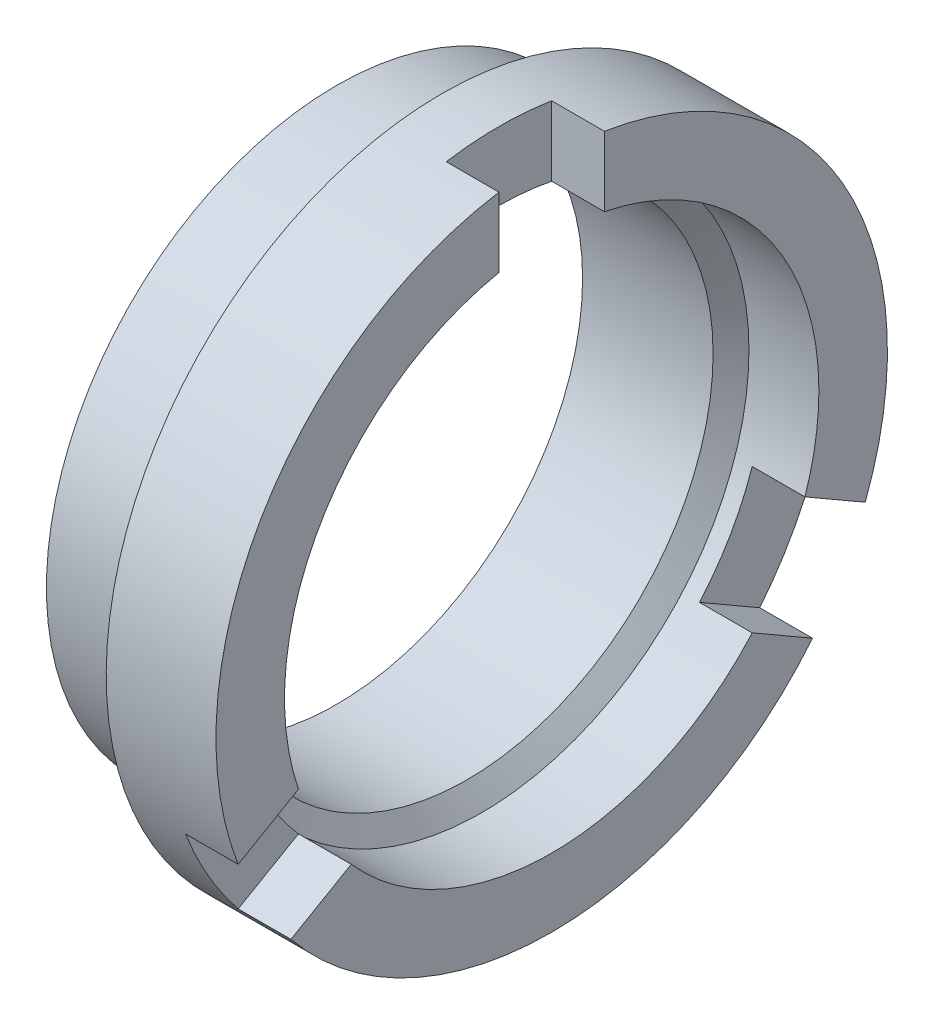
ISO-10303-21;
HEADER;
FILE_DESCRIPTION(('STEP AP214'),'2;1');
FILE_NAME('part.step','',(''),(''),'','','');
FILE_SCHEMA(('AUTOMOTIVE_DESIGN { 1 0 10303 214 1 1 1 1 }'));
ENDSEC;
DATA;
#1=APPLICATION_CONTEXT('core data for automotive mechanical design processes');
#2=APPLICATION_PROTOCOL_DEFINITION('international standard','automotive_design',2000,#1);
#3=PRODUCT_CONTEXT('',#1,'mechanical');
#4=PRODUCT('Part','Part','',(#3));
#5=PRODUCT_RELATED_PRODUCT_CATEGORY('part','',(#4));
#6=PRODUCT_DEFINITION_FORMATION('','',#4);
#7=PRODUCT_DEFINITION_CONTEXT('part definition',#1,'design');
#8=PRODUCT_DEFINITION('design','',#6,#7);
#9=PRODUCT_DEFINITION_SHAPE('','',#8);
#10=(LENGTH_UNIT() NAMED_UNIT(*) SI_UNIT(.MILLI.,.METRE.));
#11=(NAMED_UNIT(*) PLANE_ANGLE_UNIT() SI_UNIT($,.RADIAN.));
#12=(NAMED_UNIT(*) SI_UNIT($,.STERADIAN.) SOLID_ANGLE_UNIT());
#13=UNCERTAINTY_MEASURE_WITH_UNIT(LENGTH_MEASURE(1.E-05),#10,'distance_accuracy_value','');
#14=(GEOMETRIC_REPRESENTATION_CONTEXT(3) GLOBAL_UNCERTAINTY_ASSIGNED_CONTEXT((#13)) GLOBAL_UNIT_ASSIGNED_CONTEXT((#10,
#11,#12)) REPRESENTATION_CONTEXT('',''));
#15=CARTESIAN_POINT('',(0.,0.,0.));
#16=DIRECTION('',(0.,0.,1.));
#17=DIRECTION('',(1.,0.,0.));
#18=AXIS2_PLACEMENT_3D('',#15,#16,#17);
#19=CARTESIAN_POINT('',(-114.182210271339,-2.88366824144157,12.7336330130561));
#20=DIRECTION('',(-1.,0.,0.));
#21=DIRECTION('',(0.,0.,1.));
#22=AXIS2_PLACEMENT_3D('',#19,#20,#21);
#23=PLANE('',#22);
#24=CARTESIAN_POINT('',(-114.182210271339,-2.88366824144157,12.7336330130561));
#25=DIRECTION('',(-1.,0.,0.));
#26=DIRECTION('',(0.,0.,1.));
#27=AXIS2_PLACEMENT_3D('',#24,#25,#26);
#28=CIRCLE('',#27,9.55);
#29=CARTESIAN_POINT('',(-114.182210271339,-8.89843799766828,5.31574619944263));
#30=VERTEX_POINT('',#29);
#31=CARTESIAN_POINT('',(-114.182210271339,-8.8984379976684,20.1515198266695));
#32=VERTEX_POINT('',#31);
#33=EDGE_CURVE('E261',#30,#32,#28,.T.);
#34=ORIENTED_EDGE('',*,*,#33,.F.);
#35=DIRECTION('',(0.,0.499999999999992,0.866025403784443));
#36=VECTOR('',#35,1.);
#37=CARTESIAN_POINT('',(-114.182210271339,-10.7061606628907,2.18467869728347));
#38=LINE('',#37,#36);
#39=CARTESIAN_POINT('',(-114.182210271339,-7.90795801646888,7.0313078507599));
#40=VERTEX_POINT('',#39);
#41=EDGE_CURVE('E141',#30,#40,#38,.T.);
#42=ORIENTED_EDGE('',*,*,#41,.T.);
#43=CARTESIAN_POINT('',(-114.182210271339,-2.88366824144159,12.7336330130561));
#44=DIRECTION('',(-1.,0.,0.));
#45=DIRECTION('',(0.,0.,1.));
#46=AXIS2_PLACEMENT_3D('',#43,#44,#45);
#47=CIRCLE('',#46,7.6);
#48=CARTESIAN_POINT('',(-114.182210271339,-7.90795801646896,18.4359581753522));
#49=VERTEX_POINT('',#48);
#50=EDGE_CURVE('E56',#40,#49,#47,.T.);
#51=ORIENTED_EDGE('',*,*,#50,.T.);
#52=DIRECTION('',(0.,0.500000000000004,-0.866025403784436));
#53=VECTOR('',#52,1.);
#54=CARTESIAN_POINT('',(-114.182210271339,-10.7061606628909,23.2825873288286));
#55=LINE('',#54,#53);
#56=EDGE_CURVE('E167',#32,#49,#55,.T.);
#57=ORIENTED_EDGE('',*,*,#56,.F.);
#58=EDGE_LOOP('',(#34,#42,#51,#57));
#59=FACE_BOUND('',#58,.T.);
#60=ADVANCED_FACE('F31',(#59),#23,.F.);
#61=CARTESIAN_POINT('',(-114.182210271339,-6.30036178631508,21.6515198266695));
#62=VERTEX_POINT('',#61);
#63=CARTESIAN_POINT('',(-114.182210271339,6.54779505965864,14.2336330130561));
#64=VERTEX_POINT('',#63);
#65=EDGE_CURVE('E262',#62,#64,#28,.T.);
#66=ORIENTED_EDGE('',*,*,#65,.F.);
#67=DIRECTION('',(0.,0.500000000000004,-0.866025403784436));
#68=VECTOR('',#67,1.);
#69=CARTESIAN_POINT('',(-114.182210271339,-8.10808445153759,24.7825873288287));
#70=LINE('',#69,#68);
#71=CARTESIAN_POINT('',(-114.182210271339,-5.30988180511565,19.9359581753522));
#72=VERTEX_POINT('',#71);
#73=EDGE_CURVE('E168',#62,#72,#70,.T.);
#74=ORIENTED_EDGE('',*,*,#73,.T.);
#75=CARTESIAN_POINT('',(-114.182210271339,4.56683509725976,14.2336330130561));
#76=VERTEX_POINT('',#75);
#77=EDGE_CURVE('E266',#72,#76,#47,.T.);
#78=ORIENTED_EDGE('',*,*,#77,.T.);
#79=DIRECTION('',(0.,-1.,0.));
#80=VECTOR('',#79,1.);
#81=CARTESIAN_POINT('',(-114.182210271339,6.66733175855844,14.2336330130561));
#82=LINE('',#81,#80);
#83=EDGE_CURVE('E193',#64,#76,#82,.T.);
#84=ORIENTED_EDGE('',*,*,#83,.F.);
#85=EDGE_LOOP('',(#66,#74,#78,#84));
#86=FACE_BOUND('',#85,.T.);
#87=ADVANCED_FACE('F294',(#86),#23,.F.);
#88=CARTESIAN_POINT('',(-117.303649130669,41.4790301307664,1.73363301305615));
#89=DIRECTION('',(1.,0.,0.));
#90=DIRECTION('',(0.,0.,-1.));
#91=AXIS2_PLACEMENT_3D('',#88,#89,#90);
#92=PLANE('',#91);
#93=CARTESIAN_POINT('',(-117.303649130669,-2.88366824144157,12.7336330130561));
#94=DIRECTION('',(1.,0.,0.));
#95=DIRECTION('',(0.,1.,0.));
#96=AXIS2_PLACEMENT_3D('',#93,#94,#95);
#97=CIRCLE('',#96,9.55);
#98=CARTESIAN_POINT('',(-117.303649130669,6.66633175855844,12.7336330130561));
#99=VERTEX_POINT('',#98);
#100=EDGE_CURVE('E258',#99,#99,#97,.T.);
#101=ORIENTED_EDGE('',*,*,#100,.F.);
#102=EDGE_LOOP('',(#101));
#103=FACE_BOUND('',#102,.T.);
#104=CARTESIAN_POINT('',(-117.303649130669,-2.88366824144157,12.7336330130561));
#105=DIRECTION('',(1.,0.,0.));
#106=DIRECTION('',(0.,1.,0.));
#107=AXIS2_PLACEMENT_3D('',#104,#105,#106);
#108=CIRCLE('',#107,8.25);
#109=CARTESIAN_POINT('',(-117.303649130669,5.36633175855843,12.7336330130561));
#110=VERTEX_POINT('',#109);
#111=EDGE_CURVE('E11',#110,#110,#108,.F.);
#112=ORIENTED_EDGE('',*,*,#111,.F.);
#113=EDGE_LOOP('',(#112));
#114=FACE_BOUND('',#113,.T.);
#115=ADVANCED_FACE('F33',(#103,#114),#92,.F.);
#116=CARTESIAN_POINT('',(-114.182210271339,4.56683509725976,11.2336330130561));
#117=VERTEX_POINT('',#116);
#118=CARTESIAN_POINT('',(-114.182210271339,-5.30988180511554,5.53130785075992));
#119=VERTEX_POINT('',#118);
#120=EDGE_CURVE('E35',#117,#119,#47,.T.);
#121=ORIENTED_EDGE('',*,*,#120,.T.);
#122=DIRECTION('',(0.,0.499999999999992,0.866025403784443));
#123=VECTOR('',#122,1.);
#124=CARTESIAN_POINT('',(-114.182210271339,-8.10808445153738,0.684678697283492));
#125=LINE('',#124,#123);
#126=CARTESIAN_POINT('',(-114.182210271339,-6.30036178631494,3.81574619944265));
#127=VERTEX_POINT('',#126);
#128=EDGE_CURVE('E48',#127,#119,#125,.T.);
#129=ORIENTED_EDGE('',*,*,#128,.F.);
#130=CARTESIAN_POINT('',(-114.182210271339,6.54779505965864,11.2336330130561));
#131=VERTEX_POINT('',#130);
#132=EDGE_CURVE('E40',#131,#127,#28,.T.);
#133=ORIENTED_EDGE('',*,*,#132,.F.);
#134=DIRECTION('',(0.,-1.,0.));
#135=VECTOR('',#134,1.);
#136=CARTESIAN_POINT('',(-114.182210271339,6.66733175855844,11.2336330130561));
#137=LINE('',#136,#135);
#138=EDGE_CURVE('E194',#131,#117,#137,.T.);
#139=ORIENTED_EDGE('',*,*,#138,.T.);
#140=EDGE_LOOP('',(#121,#129,#133,#139));
#141=FACE_BOUND('',#140,.T.);
#142=ADVANCED_FACE('F273',(#141),#23,.F.);
#143=CARTESIAN_POINT('',(-148.315128171995,-2.88366824144157,12.7336330130561));
#144=DIRECTION('',(1.,0.,0.));
#145=DIRECTION('',(0.,0.,-1.));
#146=AXIS2_PLACEMENT_3D('',#143,#144,#145);
#147=CYLINDRICAL_SURFACE('',#146,9.55);
#148=ORIENTED_EDGE('',*,*,#100,.T.);
#149=EDGE_LOOP('',(#148));
#150=FACE_BOUND('',#149,.T.);
#151=CARTESIAN_POINT('',(-115.682210271339,-2.88366824144157,12.7336330130561));
#152=DIRECTION('',(-1.,0.,0.));
#153=DIRECTION('',(0.,0.,1.));
#154=AXIS2_PLACEMENT_3D('',#151,#152,#153);
#155=CIRCLE('',#154,9.55);
#156=CARTESIAN_POINT('',(-115.682210271339,-8.89843799766828,5.31574619944263));
#157=VERTEX_POINT('',#156);
#158=CARTESIAN_POINT('',(-115.682210271339,-6.30036178631494,3.81574619944265));
#159=VERTEX_POINT('',#158);
#160=EDGE_CURVE('E131',#157,#159,#155,.F.);
#161=ORIENTED_EDGE('',*,*,#160,.F.);
#162=DIRECTION('',(1.,0.,0.));
#163=VECTOR('',#162,1.);
#164=CARTESIAN_POINT('',(-148.315128171995,-8.89843799766828,5.31574619944263));
#165=LINE('',#164,#163);
#166=EDGE_CURVE('E149',#30,#157,#165,.F.);
#167=ORIENTED_EDGE('',*,*,#166,.F.);
#168=ORIENTED_EDGE('',*,*,#33,.T.);
#169=DIRECTION('',(1.,0.,0.));
#170=VECTOR('',#169,1.);
#171=CARTESIAN_POINT('',(-148.315128171995,-8.89843799766839,20.1515198266695));
#172=LINE('',#171,#170);
#173=CARTESIAN_POINT('',(-115.682210271339,-8.89843799766839,20.1515198266695));
#174=VERTEX_POINT('',#173);
#175=EDGE_CURVE('E179',#174,#32,#172,.T.);
#176=ORIENTED_EDGE('',*,*,#175,.F.);
#177=CARTESIAN_POINT('',(-115.682210271339,-2.88366824144157,12.7336330130561));
#178=DIRECTION('',(-1.,0.,0.));
#179=DIRECTION('',(0.,0.,1.));
#180=AXIS2_PLACEMENT_3D('',#177,#178,#179);
#181=CIRCLE('',#180,9.55);
#182=CARTESIAN_POINT('',(-115.682210271339,-6.30036178631508,21.6515198266695));
#183=VERTEX_POINT('',#182);
#184=EDGE_CURVE('E161',#183,#174,#181,.F.);
#185=ORIENTED_EDGE('',*,*,#184,.F.);
#186=DIRECTION('',(1.,0.,0.));
#187=VECTOR('',#186,1.);
#188=CARTESIAN_POINT('',(-148.315128171995,-6.30036178631508,21.6515198266695));
#189=LINE('',#188,#187);
#190=EDGE_CURVE('E164',#62,#183,#189,.F.);
#191=ORIENTED_EDGE('',*,*,#190,.F.);
#192=ORIENTED_EDGE('',*,*,#65,.T.);
#193=DIRECTION('',(1.,0.,0.));
#194=VECTOR('',#193,1.);
#195=CARTESIAN_POINT('',(-148.315128171995,6.54779505965864,14.2336330130561));
#196=LINE('',#195,#194);
#197=CARTESIAN_POINT('',(-115.682210271339,6.54779505965864,14.2336330130561));
#198=VERTEX_POINT('',#197);
#199=EDGE_CURVE('E206',#198,#64,#196,.T.);
#200=ORIENTED_EDGE('',*,*,#199,.F.);
#201=CARTESIAN_POINT('',(-115.682210271339,-2.88366824144157,12.7336330130561));
#202=DIRECTION('',(-1.,0.,0.));
#203=DIRECTION('',(0.,-1.,0.));
#204=AXIS2_PLACEMENT_3D('',#201,#202,#203);
#205=CIRCLE('',#204,9.55);
#206=CARTESIAN_POINT('',(-115.682210271339,6.54779505965864,11.2336330130561));
#207=VERTEX_POINT('',#206);
#208=EDGE_CURVE('E187',#207,#198,#205,.F.);
#209=ORIENTED_EDGE('',*,*,#208,.F.);
#210=DIRECTION('',(1.,0.,0.));
#211=VECTOR('',#210,1.);
#212=CARTESIAN_POINT('',(-148.315128171995,6.54779505965864,11.2336330130561));
#213=LINE('',#212,#211);
#214=EDGE_CURVE('E190',#131,#207,#213,.F.);
#215=ORIENTED_EDGE('',*,*,#214,.F.);
#216=ORIENTED_EDGE('',*,*,#132,.T.);
#217=DIRECTION('',(1.,0.,0.));
#218=VECTOR('',#217,1.);
#219=CARTESIAN_POINT('',(-148.315128171995,-6.30036178631494,3.81574619944265));
#220=LINE('',#219,#218);
#221=EDGE_CURVE('E140',#159,#127,#220,.T.);
#222=ORIENTED_EDGE('',*,*,#221,.F.);
#223=EDGE_LOOP('',(#161,#167,#168,#176,#185,#191,#192,#200,#209,#215,#216,#222));
#224=FACE_BOUND('',#223,.T.);
#225=ADVANCED_FACE('F299',(#150,#224),#147,.T.);
#226=CARTESIAN_POINT('',(-148.315128171995,-2.88366824144157,12.7336330130561));
#227=DIRECTION('',(1.,0.,0.));
#228=DIRECTION('',(0.,0.,-1.));
#229=AXIS2_PLACEMENT_3D('',#226,#227,#228);
#230=CYLINDRICAL_SURFACE('',#229,6.99999999999997);
#231=CARTESIAN_POINT('',(-116.591349033031,-2.88366824144159,12.7336330130561));
#232=DIRECTION('',(1.,0.,0.));
#233=DIRECTION('',(0.,0.,-1.));
#234=AXIS2_PLACEMENT_3D('',#231,#232,#233);
#235=CIRCLE('',#234,6.99999999999994);
#236=CARTESIAN_POINT('',(-116.591349033031,-2.88366824144159,5.73363301305614));
#237=VERTEX_POINT('',#236);
#238=EDGE_CURVE('E264',#237,#237,#235,.F.);
#239=ORIENTED_EDGE('',*,*,#238,.F.);
#240=EDGE_LOOP('',(#239));
#241=FACE_BOUND('',#240,.T.);
#242=CARTESIAN_POINT('',(-120.303649130669,-2.88366824144157,12.7336330130561));
#243=DIRECTION('',(1.,0.,0.));
#244=DIRECTION('',(0.,1.,0.));
#245=AXIS2_PLACEMENT_3D('',#242,#243,#244);
#246=CIRCLE('',#245,6.99999999999997);
#247=CARTESIAN_POINT('',(-120.303649130669,4.1163317585584,12.7336330130561));
#248=VERTEX_POINT('',#247);
#249=EDGE_CURVE('E255',#248,#248,#246,.T.);
#250=ORIENTED_EDGE('',*,*,#249,.F.);
#251=EDGE_LOOP('',(#250));
#252=FACE_BOUND('',#251,.T.);
#253=ADVANCED_FACE('F314',(#241,#252),#230,.F.);
#254=CARTESIAN_POINT('',(-144.638172909825,-2.88366824144156,12.7336330130561));
#255=DIRECTION('',(1.,0.,0.));
#256=DIRECTION('',(0.,1.,0.));
#257=AXIS2_PLACEMENT_3D('',#254,#255,#256);
#258=CYLINDRICAL_SURFACE('',#257,8.25);
#259=CARTESIAN_POINT('',(-120.303649130669,-2.88366824144157,12.7336330130561));
#260=DIRECTION('',(1.,0.,0.));
#261=DIRECTION('',(0.,1.,0.));
#262=AXIS2_PLACEMENT_3D('',#259,#260,#261);
#263=CIRCLE('',#262,8.25);
#264=CARTESIAN_POINT('',(-120.303649130669,5.36633175855843,12.7336330130561));
#265=VERTEX_POINT('',#264);
#266=EDGE_CURVE('E247',#265,#265,#263,.T.);
#267=ORIENTED_EDGE('',*,*,#266,.T.);
#268=EDGE_LOOP('',(#267));
#269=FACE_BOUND('',#268,.T.);
#270=ORIENTED_EDGE('',*,*,#111,.T.);
#271=EDGE_LOOP('',(#270));
#272=FACE_BOUND('',#271,.T.);
#273=ADVANCED_FACE('F231',(#269,#272),#258,.T.);
#274=CARTESIAN_POINT('',(-120.303649130669,41.4790301307664,1.73363301305615));
#275=DIRECTION('',(1.,0.,0.));
#276=DIRECTION('',(0.,0.,-1.));
#277=AXIS2_PLACEMENT_3D('',#274,#275,#276);
#278=PLANE('',#277);
#279=ORIENTED_EDGE('',*,*,#249,.T.);
#280=EDGE_LOOP('',(#279));
#281=FACE_BOUND('',#280,.T.);
#282=ORIENTED_EDGE('',*,*,#266,.F.);
#283=EDGE_LOOP('',(#282));
#284=FACE_BOUND('',#283,.T.);
#285=ADVANCED_FACE('F229',(#281,#284),#278,.F.);
#286=CARTESIAN_POINT('',(-113.463649130669,-2.88366824144159,12.7336330130561));
#287=DIRECTION('',(1.,0.,0.));
#288=DIRECTION('',(0.,0.,-1.));
#289=AXIS2_PLACEMENT_3D('',#286,#287,#288);
#290=CYLINDRICAL_SURFACE('',#289,7.6);
#291=CARTESIAN_POINT('',(-116.171174505176,-2.8836682414416,5.13363301301582));
#292=CARTESIAN_POINT('',(-116.171174505176,-2.75931340665847,5.13363037514192));
#293=CARTESIAN_POINT('',(-116.171174505176,-2.63495879633258,5.13668504286559));
#294=CARTESIAN_POINT('',(-116.171174505176,-2.38654903677079,5.14889004884917));
#295=CARTESIAN_POINT('',(-116.171174505176,-2.2624938875349,5.15804038710912));
#296=CARTESIAN_POINT('',(-116.171174505176,-2.01498206233009,5.18241779350636));
#297=CARTESIAN_POINT('',(-116.171174505176,-1.89152538636117,5.19764486164365));
#298=CARTESIAN_POINT('',(-116.171174505175,-1.64550788478678,5.23413821292448));
#299=CARTESIAN_POINT('',(-116.171174505175,-1.52294705918129,5.25540449606797));
#300=CARTESIAN_POINT('',(-116.171174505175,-1.27901652904238,5.30392526783343));
#301=CARTESIAN_POINT('',(-116.171174505176,-1.15764682450896,5.33117975645542));
#302=CARTESIAN_POINT('',(-116.171174505176,-0.916390923827755,5.39161122102182));
#303=CARTESIAN_POINT('',(-116.171174505175,-0.796504727679993,5.4247881969663));
#304=CARTESIAN_POINT('',(-116.171174505176,-0.558504660909136,5.49698472594015));
#305=CARTESIAN_POINT('',(-116.171174505179,-0.44039079028602,5.53600427896944));
#306=CARTESIAN_POINT('',(-116.171174505173,-0.206219921004956,5.61979195628669));
#307=CARTESIAN_POINT('',(-116.171174505164,-0.0901629223469907,5.66456008057459));
#308=CARTESIAN_POINT('',(-116.171174505185,0.139614611444968,5.75973705128879));
#309=CARTESIAN_POINT('',(-116.171174505213,0.253335146578952,5.8101458977151));
#310=CARTESIAN_POINT('',(-116.171174505214,0.478165790664665,5.9164828729484));
#311=CARTESIAN_POINT('',(-116.171174505186,0.5892758996164,5.97241100175537));
#312=CARTESIAN_POINT('',(-116.171174505165,0.808618017293205,6.08965180619201));
#313=CARTESIAN_POINT('',(-116.171174505173,0.916850026018243,6.15096448182175));
#314=CARTESIAN_POINT('',(-116.171174505178,1.13017520287799,6.27882667221756));
#315=CARTESIAN_POINT('',(-116.171174505177,1.23526837101277,6.34537618698353));
#316=CARTESIAN_POINT('',(-116.171174505176,1.44206268804282,6.48355173206294));
#317=CARTESIAN_POINT('',(-116.171174505176,1.54376383693804,6.55517776237649));
#318=CARTESIAN_POINT('',(-116.171174505175,1.74352910851079,6.70333378516427));
#319=CARTESIAN_POINT('',(-116.171174505175,1.84159323118838,6.77986377763845));
#320=CARTESIAN_POINT('',(-116.171174505176,2.03384820526523,6.93764335729586));
#321=CARTESIAN_POINT('',(-116.171174505177,2.12803905666447,7.0188929444791));
#322=CARTESIAN_POINT('',(-116.171174505176,2.3123205741772,7.18591597617724));
#323=CARTESIAN_POINT('',(-116.171174505174,2.4024112402907,7.27168942069213));
#324=CARTESIAN_POINT('',(-116.171174505174,2.57827535091973,7.44755353132104));
#325=CARTESIAN_POINT('',(-116.171174505176,2.66404879543524,7.53764419743508));
#326=CARTESIAN_POINT('',(-116.171174505177,2.83107182713533,7.72192571494996));
#327=CARTESIAN_POINT('',(-116.171174505176,2.91232141431986,7.81611656635084));
#328=CARTESIAN_POINT('',(-116.171174505175,3.07010099397785,8.00837154042824));
#329=CARTESIAN_POINT('',(-116.171174505175,3.14663098645146,8.10643566310463));
#330=CARTESIAN_POINT('',(-116.171174505176,3.2947870092374,8.30620093467638));
#331=CARTESIAN_POINT('',(-116.171174505177,3.36641303954962,8.40790208357182));
#332=CARTESIAN_POINT('',(-116.171174505176,3.50458858463239,8.61469640060082));
#333=CARTESIAN_POINT('',(-116.171174505175,3.571138099403,8.71978956873434));
#334=CARTESIAN_POINT('',(-116.171174505175,3.69900028978814,8.93311474559847));
#335=CARTESIAN_POINT('',(-116.171174505177,3.7603129654026,9.0413467543291));
#336=CARTESIAN_POINT('',(-116.171174505176,3.87755376987727,9.26068887199177));
#337=CARTESIAN_POINT('',(-116.171174505174,3.93348189873753,9.37179898092379));
#338=CARTESIAN_POINT('',(-116.171174505174,4.03981887393216,9.59662962501151));
#339=CARTESIAN_POINT('',(-116.171174505176,4.09022772026649,9.71035016016723));
#340=CARTESIAN_POINT('',(-116.171174505173,4.18540469109976,9.94012769396533));
#341=CARTESIAN_POINT('',(-116.171174505167,4.23017281559869,10.0561846926077));
#342=CARTESIAN_POINT('',(-116.171174505186,4.31396049237383,10.2903555619184));
#343=CARTESIAN_POINT('',(-116.171174505211,4.35298004465015,10.4084694325868));
#344=CARTESIAN_POINT('',(-116.171174505219,4.4251765755622,10.6464694992637));
#345=CARTESIAN_POINT('',(-116.171174505203,4.45835355419781,10.7663556952723));
#346=CARTESIAN_POINT('',(-116.171174505228,4.51878501144078,11.0076115963157));
#347=CARTESIAN_POINT('',(-116.17117450527,4.54603949004826,11.1289813013505));
#348=CARTESIAN_POINT('',(-116.171174505318,4.59456028894012,11.3729118301645));
#349=CARTESIAN_POINT('',(-116.171174505324,4.61582660922446,11.4954726539437));
#350=CARTESIAN_POINT('',(-116.171174505265,4.65231985909626,11.7414901604902));
#351=CARTESIAN_POINT('',(-116.171174505199,4.66754678868372,11.8649468432575));
#352=CARTESIAN_POINT('',(-116.171174505152,4.69192457393092,12.1124586498431));
#353=CARTESIAN_POINT('',(-116.17117450517,4.70107542959063,12.2365137736615));
#354=CARTESIAN_POINT('',(-116.171174505182,4.71327902192376,12.4849236026718));
#355=CARTESIAN_POINT('',(-116.171174505177,4.71633175859716,12.6092783078638));
#356=CARTESIAN_POINT('',(-116.171174505174,4.71633175860019,12.8579877182495));
#357=CARTESIAN_POINT('',(-116.171174505178,4.71327902192977,12.9823424234431));
#358=CARTESIAN_POINT('',(-116.171174505174,4.70107542958436,13.2307522524534));
#359=CARTESIAN_POINT('',(-116.171174505167,4.69192457390943,13.35480737627));
#360=CARTESIAN_POINT('',(-116.171174505185,4.66754678870356,13.602319182861));
#361=CARTESIAN_POINT('',(-116.171174505211,4.65231985917261,13.7257758656352));
#362=CARTESIAN_POINT('',(-116.171174505219,4.61582660937485,13.9717933721942));
#363=CARTESIAN_POINT('',(-116.1711745052,4.5945602891081,14.0943541959789));
#364=CARTESIAN_POINT('',(-116.171174505229,4.54603949010666,14.3382847247708));
#365=CARTESIAN_POINT('',(-116.171174505277,4.51878501137193,14.4596544297779));
#366=CARTESIAN_POINT('',(-116.171174505312,4.45835355404396,14.7009103308017));
#367=CARTESIAN_POINT('',(-116.171174505299,4.42517657545079,14.8207965268184));
#368=CARTESIAN_POINT('',(-116.17117450529,4.35298004454146,15.0587965934898));
#369=CARTESIAN_POINT('',(-116.171174505294,4.31396049222537,15.1769104641445));
#370=CARTESIAN_POINT('',(-116.171174505297,4.23017281542143,15.411081333442));
#371=CARTESIAN_POINT('',(-116.171174505295,4.18540469093353,15.5271383320848));
#372=CARTESIAN_POINT('',(-116.171174505294,4.09022772010958,15.7569158658786));
#373=CARTESIAN_POINT('',(-116.171174505294,4.03981887377357,15.8706364010297));
#374=CARTESIAN_POINT('',(-116.171174505294,3.93348189858104,16.0954670451115));
#375=CARTESIAN_POINT('',(-116.171174505295,3.87755376972452,16.2065771540421));
#376=CARTESIAN_POINT('',(-116.171174505295,3.76031296525299,16.4259192716985));
#377=CARTESIAN_POINT('',(-116.171174505296,3.69900028963799,16.5341512804243));
#378=CARTESIAN_POINT('',(-116.171174505294,3.57113809925697,16.7474764572845));
#379=CARTESIAN_POINT('',(-116.171174505292,3.50458858449091,16.852569625419));
#380=CARTESIAN_POINT('',(-116.171174505294,3.36641303941052,17.0593639424428));
#381=CARTESIAN_POINT('',(-116.171174505297,3.29478700909619,17.1610650913323));
#382=CARTESIAN_POINT('',(-116.171174505296,3.14663098631212,17.3608303629021));
#383=CARTESIAN_POINT('',(-116.171174505292,3.0701009938423,17.4588944855824));
#384=CARTESIAN_POINT('',(-116.171174505292,2.91232141418752,17.6511494596561));
#385=CARTESIAN_POINT('',(-116.171174505297,2.83107182700265,17.7453403110495));
#386=CARTESIAN_POINT('',(-116.171174505297,2.66404879530728,17.9296218285552));
#387=CARTESIAN_POINT('',(-116.171174505294,2.57827535079678,18.0197124946675));
#388=CARTESIAN_POINT('',(-116.171174505289,2.4024112401774,18.1955766052977));
#389=CARTESIAN_POINT('',(-116.171174505287,2.31232057406847,18.2813500498156));
#390=CARTESIAN_POINT('',(-116.1711745053,2.12803905654825,18.4483730814963));
#391=CARTESIAN_POINT('',(-116.171174505316,2.03384820513698,18.5296226686592));
#392=CARTESIAN_POINT('',(-116.171174505265,1.84159323110801,18.687402248371));
#393=CARTESIAN_POINT('',(-116.171174505199,1.74352910849026,18.7639322409199));
#394=CARTESIAN_POINT('',(-116.171174505154,1.54376383696017,18.9120882637578));
#395=CARTESIAN_POINT('',(-116.171174505175,1.44206268804777,18.9837142940467));
#396=CARTESIAN_POINT('',(-116.171174505186,1.23526837100771,19.121889839117));
#397=CARTESIAN_POINT('',(-116.171174505176,1.13017520288005,19.1884393538984));
#398=CARTESIAN_POINT('',(-116.171174505172,0.916850026016989,19.3163015442909));
#399=CARTESIAN_POINT('',(-116.171174505177,0.808618017281532,19.377614219902));
#400=CARTESIAN_POINT('',(-116.171174505178,0.589275899614646,19.4948550243762));
#401=CARTESIAN_POINT('',(-116.171174505174,0.478165790683264,19.5507831532394));
#402=CARTESIAN_POINT('',(-116.171174505171,0.253335146600073,19.6571201284353));
#403=CARTESIAN_POINT('',(-116.171174505173,0.13961461144836,19.7075289747683));
#404=CARTESIAN_POINT('',(-116.171174505176,-0.0901629223532225,19.8027059455929));
#405=CARTESIAN_POINT('',(-116.171174505177,-0.20621992100327,19.847474070084));
#406=CARTESIAN_POINT('',(-116.171174505178,-0.440390790307492,19.9312617468857));
#407=CARTESIAN_POINT('',(-116.171174505177,-0.558504660961489,19.9702812991967));
#408=CARTESIAN_POINT('',(-116.171174505171,-0.796504727630565,20.0424778301269));
#409=CARTESIAN_POINT('',(-116.171174505167,-0.916390923645741,20.0756548087458));
#410=CARTESIAN_POINT('',(-116.171174505184,-1.15764682469003,20.1360862660011));
#411=CARTESIAN_POINT('',(-116.171174505205,-1.27901652971911,20.1633407446375));
#412=CARTESIAN_POINT('',(-116.171174505223,-1.52294705852943,20.2118615435729));
#413=CARTESIAN_POINT('',(-116.17117450522,-1.64550788231068,20.2331278638717));
#414=CARTESIAN_POINT('',(-116.171174505214,-1.8915253888687,20.269621113668));
#415=CARTESIAN_POINT('',(-116.17117450521,-2.01498207164543,20.2848480431656));
#416=CARTESIAN_POINT('',(-116.171174505211,-2.26249387823372,20.3092258283434));
#417=CARTESIAN_POINT('',(-116.171174505214,-2.38654900204527,20.3183766840237));
#418=CARTESIAN_POINT('',(-116.171174505217,-2.63495883105172,20.3305802763704));
#419=CARTESIAN_POINT('',(-116.171174505217,-2.75931353624665,20.3336330130363));
#420=CARTESIAN_POINT('',(-116.171174505217,-3.00802294663656,20.3336330130366));
#421=CARTESIAN_POINT('',(-116.171174505217,-3.13237765183156,20.3305802763709));
#422=CARTESIAN_POINT('',(-116.171174505215,-3.38078748083792,20.3183766840232));
#423=CARTESIAN_POINT('',(-116.171174505212,-3.50484260464931,20.3092258283415));
#424=CARTESIAN_POINT('',(-116.171174505209,-3.75235441124033,20.284848043167));
#425=CARTESIAN_POINT('',(-116.171174505209,-3.87581109401994,20.2696211136739));
#426=CARTESIAN_POINT('',(-116.171174505211,-4.1218286005781,20.2331278638835));
#427=CARTESIAN_POINT('',(-116.171174505214,-4.24438942435666,20.2118615435863));
#428=CARTESIAN_POINT('',(-116.171174505215,-4.48831995315824,20.163340744625));
#429=CARTESIAN_POINT('',(-116.171174505213,-4.60968965818124,20.1360862659609));
#430=CARTESIAN_POINT('',(-116.171174505215,-4.85094555921527,20.0756548086805));
#431=CARTESIAN_POINT('',(-116.171174505218,-4.97083175522631,20.0424778300642));
#432=CARTESIAN_POINT('',(-116.171174505219,-5.20883182190095,19.9702812991394));
#433=CARTESIAN_POINT('',(-116.171174505216,-5.32694569256448,19.9312617468306));
#434=CARTESIAN_POINT('',(-116.171174505215,-5.56111656187262,19.8474740700286));
#435=CARTESIAN_POINT('',(-116.171174505216,-5.67717356051725,19.8027059455353));
#436=CARTESIAN_POINT('',(-116.171174505209,-5.90695109431806,19.7075289747183));
#437=CARTESIAN_POINT('',(-116.171174505199,-6.02067162947434,19.6571201283949));
#438=CARTESIAN_POINT('',(-116.171174505234,-6.24550227353545,19.5507831531577));
#439=CARTESIAN_POINT('',(-116.171174505278,-6.35661238244021,19.4948550242438));
#440=CARTESIAN_POINT('',(-116.17117450531,-6.57595450007792,19.37761421973));
#441=CARTESIAN_POINT('',(-116.171174505299,-6.68418650881095,19.3163015441303));
#442=CARTESIAN_POINT('',(-116.171174505291,-6.89751168567246,19.1884393537579));
#443=CARTESIAN_POINT('',(-116.171174505296,-7.00260485380094,19.1218898389853));
#444=CARTESIAN_POINT('',(-116.171174505297,-7.20939917082728,18.9837142939035));
#445=CARTESIAN_POINT('',(-116.171174505294,-7.31110031972498,18.9120882635941));
#446=CARTESIAN_POINT('',(-116.171174505292,-7.5108655912942,18.7639322408112));
#447=CARTESIAN_POINT('',(-116.171174505294,-7.60892971396592,18.687402248338));
#448=CARTESIAN_POINT('',(-116.171174505297,-7.80118468803545,18.5296226686814));
#449=CARTESIAN_POINT('',(-116.171174505299,-7.8953755394331,18.4483730814979));
#450=CARTESIAN_POINT('',(-116.171174505298,-8.07965705694171,18.2813500498026));
#451=CARTESIAN_POINT('',(-116.171174505296,-8.16974772305277,18.1955766052909));
#452=CARTESIAN_POINT('',(-116.171174505289,-8.34561183368456,18.0197124946728));
#453=CARTESIAN_POINT('',(-116.171174505285,-8.43138527820524,17.9296218285663));
#454=CARTESIAN_POINT('',(-116.171174505298,-8.59840830988572,17.7453403110465));
#455=CARTESIAN_POINT('',(-116.171174505316,-8.67965789704557,17.6511494596332));
#456=CARTESIAN_POINT('',(-116.171174505266,-8.83743747675688,17.4588944856036));
#457=CARTESIAN_POINT('',(-116.171174505198,-8.91396746930827,17.3608303629872));
#458=CARTESIAN_POINT('',(-116.17117450515,-9.062123492148,17.1610650914612));
#459=CARTESIAN_POINT('',(-116.17117450517,-9.13374952243638,17.0593639425515));
#460=CARTESIAN_POINT('',(-116.171174505185,-9.27192506750111,16.8525696255094));
#461=CARTESIAN_POINT('',(-116.17117450518,-9.33847458227727,16.7474764573769));
#462=CARTESIAN_POINT('',(-116.171174505176,-9.46633677267188,16.5341512805112));
#463=CARTESIAN_POINT('',(-116.171174505176,-9.52764944829022,16.4259192717781));
#464=CARTESIAN_POINT('',(-116.171174505175,-9.64489025276579,16.206577154116));
#465=CARTESIAN_POINT('',(-116.171174505173,-9.70081838162338,16.0954670451872));
#466=CARTESIAN_POINT('',(-116.171174505172,-9.80715535681759,15.8706364011015));
#467=CARTESIAN_POINT('',(-116.171174505174,-9.8575642031539,15.7569158659444));
#468=CARTESIAN_POINT('',(-116.171174505175,-9.95274117397968,15.5271383321451));
#469=CARTESIAN_POINT('',(-116.171174505175,-9.99750929846937,15.411081333503));
#470=CARTESIAN_POINT('',(-116.171174505175,-10.0812969752725,15.1769104642001));
#471=CARTESIAN_POINT('',(-116.171174505174,-10.1203165275858,15.0587965935392));
#472=CARTESIAN_POINT('',(-116.171174505174,-10.1925130585092,14.8207965268626));
#473=CARTESIAN_POINT('',(-116.171174505176,-10.2256900371193,14.700910330847));
#474=CARTESIAN_POINT('',(-116.171174505176,-10.2861214943993,14.4596544298086));
#475=CARTESIAN_POINT('',(-116.171174505173,-10.3133759730691,14.3382847247859));
#476=CARTESIAN_POINT('',(-116.171174505173,-10.3618967720303,14.0943541959824));
#477=CARTESIAN_POINT('',(-116.171174505174,-10.3831630923218,13.9717933722016));
#478=CARTESIAN_POINT('',(-116.171174505176,-10.4196563421065,13.7257758656401));
#479=CARTESIAN_POINT('',(-116.171174505177,-10.4348832715995,13.6023191828595));
#480=CARTESIAN_POINT('',(-116.171174505175,-10.4592610567804,13.354807376266));
#481=CARTESIAN_POINT('',(-116.171174505174,-10.4684119124683,13.2307522524531));
#482=CARTESIAN_POINT('',(-116.171174505175,-10.4806155048168,12.9823424234455));
#483=CARTESIAN_POINT('',(-116.171174505179,-10.4836682414772,12.8579877182508));
#484=CARTESIAN_POINT('',(-116.171174505179,-10.4836682414771,12.6092783078637));
#485=CARTESIAN_POINT('',(-116.171174505175,-10.4806155048167,12.4849236026712));
#486=CARTESIAN_POINT('',(-116.171174505173,-10.4684119124689,12.2365137736638));
#487=CARTESIAN_POINT('',(-116.171174505175,-10.4592610567814,12.1124586498487));
#488=CARTESIAN_POINT('',(-116.171174505177,-10.4348832715988,11.8649468432533));
#489=CARTESIAN_POINT('',(-116.171174505178,-10.4196563421036,11.7414901604729));
#490=CARTESIAN_POINT('',(-116.171174505172,-10.3831630923247,11.4954726539104));
#491=CARTESIAN_POINT('',(-116.171174505165,-10.3618967720412,11.3729118301282));
#492=CARTESIAN_POINT('',(-116.171174505181,-10.3133759730587,11.1289813013299));
#493=CARTESIAN_POINT('',(-116.171174505204,-10.2861214943597,11.0076115963137));
#494=CARTESIAN_POINT('',(-116.171174505224,-10.2256900370522,10.7663556952828));
#495=CARTESIAN_POINT('',(-116.171174505221,-10.1925130584438,10.6464694992682));
#496=CARTESIAN_POINT('',(-116.171174505217,-10.1203165275257,10.4084694325925));
#497=CARTESIAN_POINT('',(-116.171174505216,-10.0812969752159,10.2903555619313));
#498=CARTESIAN_POINT('',(-116.171174505216,-9.99750929841374,10.0561846926302));
#499=CARTESIAN_POINT('',(-116.171174505218,-9.95274117392152,9.94012769399011));
#500=CARTESIAN_POINT('',(-116.171174505219,-9.85756420309433,9.7103501601946));
#501=CARTESIAN_POINT('',(-116.171174505217,-9.80715535675917,9.59662962503923));
#502=CARTESIAN_POINT('',(-116.171174505216,-9.70081838156563,9.37179898094892));
#503=CARTESIAN_POINT('',(-116.171174505216,-9.64489025270721,9.260688872014));
#504=CARTESIAN_POINT('',(-116.171174505216,-9.52764944823346,9.04134675435222));
#505=CARTESIAN_POINT('',(-116.171174505216,-9.46633677261831,8.93311474562524));
#506=CARTESIAN_POINT('',(-116.171174505218,-9.33847458223102,8.71978956876538));
#507=CARTESIAN_POINT('',(-116.171174505221,-9.27192506745879,8.61469640063256));
#508=CARTESIAN_POINT('',(-116.171174505211,-9.13374952238969,8.4079020835962));
#509=CARTESIAN_POINT('',(-116.171174505198,-9.06212349209292,8.30620093469261));
#510=CARTESIAN_POINT('',(-116.17117450523,-8.91396746927069,8.10643566315309));
#511=CARTESIAN_POINT('',(-116.171174505276,-8.8374374767452,8.00837154051717));
#512=CARTESIAN_POINT('',(-116.17117450531,-8.67965789705278,7.8161165664745));
#513=CARTESIAN_POINT('',(-116.171174505299,-8.59840830988592,7.72192571506768));
#514=CARTESIAN_POINT('',(-116.171174505291,-8.43138527819892,7.53764419755237));
#515=CARTESIAN_POINT('',(-116.171174505294,-8.34561183367865,7.44755353144399));
#516=CARTESIAN_POINT('',(-116.171174505295,-8.16974772305152,7.27168942081899));
#517=CARTESIAN_POINT('',(-116.171174505293,-8.07965705694476,7.18591597630226));
#518=CARTESIAN_POINT('',(-116.171174505292,-7.89537553943809,7.01889294460605));
#519=CARTESIAN_POINT('',(-116.171174505294,-7.80118468803812,6.93764335742664));
#520=CARTESIAN_POINT('',(-116.171174505294,-7.60892971396403,6.77986377777423));
#521=CARTESIAN_POINT('',(-116.171174505294,-7.51086559128997,6.70333378530117));
#522=CARTESIAN_POINT('',(-116.171174505294,-7.31110031972436,6.55517776251911));
#523=CARTESIAN_POINT('',(-116.171174505296,-7.20939917083283,6.48355173221011));
#524=CARTESIAN_POINT('',(-116.171174505292,-7.00260485381009,6.34537618712736));
#525=CARTESIAN_POINT('',(-116.171174505288,-6.89751168567881,6.27882667235373));
#526=CARTESIAN_POINT('',(-116.171174505302,-6.6841865088084,6.15096448198474));
#527=CARTESIAN_POINT('',(-116.17117450532,-6.57595450006928,6.08965180638936));
#528=CARTESIAN_POINT('',(-116.17117450527,-6.35661238244188,5.97241100186189));
#529=CARTESIAN_POINT('',(-116.171174505201,-6.24550227355359,5.91648287292982));
#530=CARTESIAN_POINT('',(-116.17117450515,-6.02067162950345,5.81014589763281));
#531=CARTESIAN_POINT('',(-116.171174505168,-5.9069510943416,5.75973705126788));
#532=CARTESIAN_POINT('',(-116.171174505181,-5.67717356052757,5.6645600805975));
#533=CARTESIAN_POINT('',(-116.171174505177,-5.56111656187533,5.61979195629218));
#534=CARTESIAN_POINT('',(-116.171174505174,-5.32694569259813,5.53600427896241));
#535=CARTESIAN_POINT('',(-116.171174505175,-5.20883182197319,5.49698472593788));
#536=CARTESIAN_POINT('',(-116.171174505176,-4.97083175520106,5.42478819696766));
#537=CARTESIAN_POINT('',(-116.171174505176,-4.85094555905386,5.39161122102205));
#538=CARTESIAN_POINT('',(-116.171174505176,-4.60968965837355,5.33117975645492));
#539=CARTESIAN_POINT('',(-116.171174505175,-4.48831995384048,5.30392526783329));
#540=CARTESIAN_POINT('',(-116.171174505175,-4.24438942370122,5.25540449606791));
#541=CARTESIAN_POINT('',(-116.171174505175,-4.12182859809504,5.23413821292418));
#542=CARTESIAN_POINT('',(-116.171174505176,-3.8758110965212,5.19764486164344));
#543=CARTESIAN_POINT('',(-116.171174505176,-3.75235442055354,5.1824177935064));
#544=CARTESIAN_POINT('',(-116.171174505176,-3.50484259535026,5.15804038710931));
#545=CARTESIAN_POINT('',(-116.171174505176,-3.38078744611462,5.14889004884933));
#546=CARTESIAN_POINT('',(-116.171174505176,-3.13237768655227,5.13668504286561));
#547=CARTESIAN_POINT('',(-116.171174505176,-3.00802307622556,5.13363037514189));
#548=CARTESIAN_POINT('',(-116.171174505176,-2.8836682414416,5.13363301301582));
#549=B_SPLINE_CURVE_WITH_KNOTS('',3,(#291,#292,#293,#294,#295,#296,#297,#298,#299,#300,#301,
#302,#303,#304,#305,#306,#307,#308,#309,#310,#311,#312,#313,#314,#315,#316,#317,#318,#319,#320,
#321,#322,#323,#324,#325,#326,#327,#328,#329,#330,#331,#332,#333,#334,#335,#336,#337,#338,#339,
#340,#341,#342,#343,#344,#345,#346,#347,#348,#349,#350,#351,#352,#353,#354,#355,#356,#357,#358,
#359,#360,#361,#362,#363,#364,#365,#366,#367,#368,#369,#370,#371,#372,#373,#374,#375,#376,#377,
#378,#379,#380,#381,#382,#383,#384,#385,#386,#387,#388,#389,#390,#391,#392,#393,#394,#395,#396,
#397,#398,#399,#400,#401,#402,#403,#404,#405,#406,#407,#408,#409,#410,#411,#412,#413,#414,#415,
#416,#417,#418,#419,#420,#421,#422,#423,#424,#425,#426,#427,#428,#429,#430,#431,#432,#433,#434,
#435,#436,#437,#438,#439,#440,#441,#442,#443,#444,#445,#446,#447,#448,#449,#450,#451,#452,#453,
#454,#455,#456,#457,#458,#459,#460,#461,#462,#463,#464,#465,#466,#467,#468,#469,#470,#471,#472,
#473,#474,#475,#476,#477,#478,#479,#480,#481,#482,#483,#484,#485,#486,#487,#488,#489,#490,#491,
#492,#493,#494,#495,#496,#497,#498,#499,#500,#501,#502,#503,#504,#505,#506,#507,#508,#509,#510,
#511,#512,#513,#514,#515,#516,#517,#518,#519,#520,#521,#522,#523,#524,#525,#526,#527,#528,#529,
#530,#531,#532,#533,#534,#535,#536,#537,#538,#539,#540,#541,#542,#543,#544,#545,#546,#547,#548),
.UNSPECIFIED.,.F.,.F.,(4,2,2,2,2,2,2,2,2,2,2,2,2,2,2,2,2,2,2,2,2,2,2,2,2,2,2,2,2,2,2,2,2,2,2,2,
2,2,2,2,2,2,2,2,2,2,2,2,2,2,2,2,2,2,2,2,2,2,2,2,2,2,2,2,2,2,2,2,2,2,2,2,2,2,2,2,2,2,2,2,2,2,2,2,
2,2,2,2,2,2,2,2,2,2,2,2,2,2,2,2,2,2,2,2,2,2,2,2,2,2,2,2,2,2,2,2,2,2,2,2,2,2,2,2,2,2,2,2,4),(0.,
0.37302667354948,0.746053347101018,1.11908002065229,1.4921066941997,1.86513336774905,
2.23816004130364,2.61118671485399,2.98421338840159,3.35724006195083,3.73026673549918,
4.10329340905163,4.47632008259726,4.84934675615053,5.22237342969908,5.59540010324926,
5.96842677679885,6.34145345035086,6.71448012390737,7.08750679745178,7.46053347100415,
7.83356014455153,8.20658681810312,8.57961349165218,8.95264016520415,9.32566683875582,
9.69869351229906,10.0717201858492,10.4447468593921,10.8177735329383,11.1908002064846,
11.5638268800329,11.9368535535825,12.3098802271353,12.6829069006837,13.0559335742328,
13.4289602477781,13.8019869213258,14.1750135948687,14.548040268408,14.9210669419511,
15.2940936154916,15.6671202890321,16.0401469625719,16.4131736361142,16.7862003096555,
17.1592269832024,17.5322536567421,17.9052803302811,18.2783070038247,18.6513336773663,
19.0243603509106,19.3973870244609,19.7704136980127,20.1434403715708,20.5164670451229,
20.8894937186611,21.2625203922276,21.6355470657621,22.008573739317,22.381600412865,
22.7546270864194,23.1276537599615,23.5006804334974,23.8737071070537,24.2467337806102,
24.619760454146,24.9927871276954,25.3658138012397,25.738840474788,26.1118671483303,
26.4848938218891,26.8579204954436,27.2309471689807,27.6039738425294,27.9770005160678,
28.3500271896045,28.723053863158,29.0960805366904,29.4691072102375,29.8421338837761,
30.2151605573202,30.5881872308604,30.9612139044064,31.3342405779485,31.7072672515046,
32.0802939250675,32.4533205986047,32.826347272162,33.1993739457048,33.5724006192604,
33.9454272928111,34.3184539663623,34.69148063991,35.0645073134631,35.4375339870043,
35.8105606605596,36.1835873341081,36.5566140076556,36.9296406812093,37.3026673547557,
37.6756940283069,38.0487207018546,38.4217473754071,38.7947740489468,39.1678007224982,
39.5408273960528,39.9138540695953,40.286880743145,40.659907416688,41.0329340902325,
41.4059607637703,41.7789874373187,42.1520141108579,42.525040784402,42.8980674579401,
43.2710941314775,43.6441208050235,44.0171474785679,44.3901741521136,44.7632008256595,
45.1362274992139,45.5092541727632,45.8822808463177,46.2553075198656,46.6283341934153,
47.0013608669627,47.3743875405135,47.7474142140654),.UNSPECIFIED.);
#550=CARTESIAN_POINT('',(-116.171174505176,-2.8836682414416,5.13363301301582));
#551=VERTEX_POINT('',#550);
#552=EDGE_CURVE('E209',#551,#551,#549,.T.);
#553=ORIENTED_EDGE('',*,*,#552,.F.);
#554=EDGE_LOOP('',(#553));
#555=FACE_BOUND('',#554,.T.);
#556=ORIENTED_EDGE('',*,*,#50,.F.);
#557=DIRECTION('',(1.,0.,0.));
#558=VECTOR('',#557,1.);
#559=CARTESIAN_POINT('',(-113.463649130669,-7.90795801646888,7.0313078507599));
#560=LINE('',#559,#558);
#561=CARTESIAN_POINT('',(-115.682210271339,-7.90795801646888,7.0313078507599));
#562=VERTEX_POINT('',#561);
#563=EDGE_CURVE('E144',#562,#40,#560,.T.);
#564=ORIENTED_EDGE('',*,*,#563,.F.);
#565=CARTESIAN_POINT('',(-115.682210271339,-2.88366824144159,12.7336330130561));
#566=DIRECTION('',(-1.,0.,0.));
#567=DIRECTION('',(0.,0.,1.));
#568=AXIS2_PLACEMENT_3D('',#565,#566,#567);
#569=CIRCLE('',#568,7.6);
#570=CARTESIAN_POINT('',(-115.682210271339,-5.30988180511554,5.53130785075992));
#571=VERTEX_POINT('',#570);
#572=EDGE_CURVE('E128',#571,#562,#569,.T.);
#573=ORIENTED_EDGE('',*,*,#572,.F.);
#574=DIRECTION('',(1.,0.,0.));
#575=VECTOR('',#574,1.);
#576=CARTESIAN_POINT('',(-113.463649130669,-5.30988180511554,5.53130785075992));
#577=LINE('',#576,#575);
#578=EDGE_CURVE('E135',#119,#571,#577,.F.);
#579=ORIENTED_EDGE('',*,*,#578,.F.);
#580=ORIENTED_EDGE('',*,*,#120,.F.);
#581=DIRECTION('',(1.,0.,0.));
#582=VECTOR('',#581,1.);
#583=CARTESIAN_POINT('',(-113.463649130669,4.56683509725976,11.2336330130561));
#584=LINE('',#583,#582);
#585=CARTESIAN_POINT('',(-115.682210271339,4.56683509725976,11.2336330130561));
#586=VERTEX_POINT('',#585);
#587=EDGE_CURVE('E185',#586,#117,#584,.T.);
#588=ORIENTED_EDGE('',*,*,#587,.F.);
#589=CARTESIAN_POINT('',(-115.682210271339,-2.88366824144159,12.7336330130561));
#590=DIRECTION('',(-1.,0.,0.));
#591=DIRECTION('',(0.,-1.,0.));
#592=AXIS2_PLACEMENT_3D('',#589,#590,#591);
#593=CIRCLE('',#592,7.6);
#594=CARTESIAN_POINT('',(-115.682210271339,4.56683509725976,14.2336330130561));
#595=VERTEX_POINT('',#594);
#596=EDGE_CURVE('E182',#595,#586,#593,.T.);
#597=ORIENTED_EDGE('',*,*,#596,.F.);
#598=DIRECTION('',(1.,0.,0.));
#599=VECTOR('',#598,1.);
#600=CARTESIAN_POINT('',(-113.463649130669,4.56683509725976,14.2336330130561));
#601=LINE('',#600,#599);
#602=EDGE_CURVE('E197',#76,#595,#601,.F.);
#603=ORIENTED_EDGE('',*,*,#602,.F.);
#604=ORIENTED_EDGE('',*,*,#77,.F.);
#605=DIRECTION('',(1.,0.,0.));
#606=VECTOR('',#605,1.);
#607=CARTESIAN_POINT('',(-113.463649130669,-5.30988180511565,19.9359581753522));
#608=LINE('',#607,#606);
#609=CARTESIAN_POINT('',(-115.682210271339,-5.30988180511565,19.9359581753522));
#610=VERTEX_POINT('',#609);
#611=EDGE_CURVE('E159',#610,#72,#608,.T.);
#612=ORIENTED_EDGE('',*,*,#611,.F.);
#613=CARTESIAN_POINT('',(-115.682210271339,-2.88366824144159,12.7336330130561));
#614=DIRECTION('',(-1.,0.,0.));
#615=DIRECTION('',(0.,0.,1.));
#616=AXIS2_PLACEMENT_3D('',#613,#614,#615);
#617=CIRCLE('',#616,7.6);
#618=CARTESIAN_POINT('',(-115.682210271339,-7.90795801646896,18.4359581753522));
#619=VERTEX_POINT('',#618);
#620=EDGE_CURVE('E156',#619,#610,#617,.T.);
#621=ORIENTED_EDGE('',*,*,#620,.F.);
#622=DIRECTION('',(1.,0.,0.));
#623=VECTOR('',#622,1.);
#624=CARTESIAN_POINT('',(-113.463649130669,-7.90795801646896,18.4359581753522));
#625=LINE('',#624,#623);
#626=EDGE_CURVE('E171',#49,#619,#625,.F.);
#627=ORIENTED_EDGE('',*,*,#626,.F.);
#628=EDGE_LOOP('',(#556,#564,#573,#579,#580,#588,#597,#603,#604,#612,#621,#627));
#629=FACE_BOUND('',#628,.T.);
#630=ADVANCED_FACE('F143',(#555,#629),#290,.F.);
#631=CARTESIAN_POINT('',(-116.070241639441,4.68655939976029,12.7336330130561));
#632=CARTESIAN_POINT('',(-116.08637746985,4.66315018602633,12.7336330130561));
#633=CARTESIAN_POINT('',(-116.10251330026,4.63974097229237,12.7336330130561));
#634=CARTESIAN_POINT('',(-116.467793757392,4.10980677759009,12.7336330130561));
#635=CARTESIAN_POINT('',(-117.070976051192,3.27742918705022,12.7336330130561));
#636=CARTESIAN_POINT('',(-117.924053568155,2.13196666006265,12.7336330130561));
#637=CARTESIAN_POINT('',(-118.592085819837,1.14286068605237,12.7336330130561));
#638=CARTESIAN_POINT('',(-119.146885627008,0.146198118870441,12.7336330130561));
#639=CARTESIAN_POINT('',(-119.671937849131,-1.17239196252598,12.7336330130561));
#640=CARTESIAN_POINT('',(-119.846619946768,-2.20469542175132,12.7336330130561));
#641=CARTESIAN_POINT('',(-119.843651061332,-2.88323070236258,12.7336330130561));
#642=B_SPLINE_CURVE_WITH_KNOTS('',3,(#631,#632,#633,#634,#635,#636,#637,#638,#639,#640,#641),
.UNSPECIFIED.,.F.,.F.,(4,2,1,1,1,1,1,4),(-0.00999948836120544,0.,0.216367397445061,
0.361524103508336,0.502322173645188,0.635900790992877,0.761913848586753,0.999948836120545),.UNSPECIFIED.);
#643=CARTESIAN_POINT('',(-113.463649130669,-2.88366824144159,12.7336330130561));
#644=DIRECTION('',(1.,0.,0.));
#645=AXIS1_PLACEMENT('',#643,#644);
#646=SURFACE_OF_REVOLUTION('',#642,#645);
#647=OFFSET_SURFACE('',#646,-0.1,.F.);
#648=ORIENTED_EDGE('',*,*,#238,.T.);
#649=EDGE_LOOP('',(#648));
#650=FACE_BOUND('',#649,.T.);
#651=ORIENTED_EDGE('',*,*,#552,.T.);
#652=EDGE_LOOP('',(#651));
#653=FACE_BOUND('',#652,.T.);
#654=ADVANCED_FACE('F223',(#650,#653),#647,.T.);
#655=CARTESIAN_POINT('',(-114.182210271339,6.66733175855844,11.2336330130561));
#656=DIRECTION('',(0.,0.,-1.));
#657=DIRECTION('',(0.,1.,0.));
#658=AXIS2_PLACEMENT_3D('',#655,#656,#657);
#659=PLANE('',#658);
#660=ORIENTED_EDGE('',*,*,#214,.T.);
#661=DIRECTION('',(0.,-1.,0.));
#662=VECTOR('',#661,1.);
#663=CARTESIAN_POINT('',(-115.682210271339,6.66733175855844,11.2336330130561));
#664=LINE('',#663,#662);
#665=EDGE_CURVE('E198',#207,#586,#664,.T.);
#666=ORIENTED_EDGE('',*,*,#665,.T.);
#667=ORIENTED_EDGE('',*,*,#587,.T.);
#668=ORIENTED_EDGE('',*,*,#138,.F.);
#669=EDGE_LOOP('',(#660,#666,#667,#668));
#670=FACE_BOUND('',#669,.T.);
#671=ADVANCED_FACE('F279',(#670),#659,.F.);
#672=CARTESIAN_POINT('',(-115.682210271339,6.66733175855844,14.2336330130561));
#673=DIRECTION('',(-1.,0.,0.));
#674=DIRECTION('',(0.,-1.,0.));
#675=AXIS2_PLACEMENT_3D('',#672,#673,#674);
#676=PLANE('',#675);
#677=ORIENTED_EDGE('',*,*,#208,.T.);
#678=DIRECTION('',(0.,-1.,0.));
#679=VECTOR('',#678,1.);
#680=CARTESIAN_POINT('',(-115.682210271339,6.66733175855844,14.2336330130561));
#681=LINE('',#680,#679);
#682=EDGE_CURVE('E200',#198,#595,#681,.T.);
#683=ORIENTED_EDGE('',*,*,#682,.T.);
#684=ORIENTED_EDGE('',*,*,#596,.T.);
#685=ORIENTED_EDGE('',*,*,#665,.F.);
#686=EDGE_LOOP('',(#677,#683,#684,#685));
#687=FACE_BOUND('',#686,.T.);
#688=ADVANCED_FACE('F283',(#687),#676,.F.);
#689=CARTESIAN_POINT('',(-114.182210271339,6.66733175855844,14.2336330130561));
#690=DIRECTION('',(0.,0.,1.));
#691=DIRECTION('',(0.,-1.,0.));
#692=AXIS2_PLACEMENT_3D('',#689,#690,#691);
#693=PLANE('',#692);
#694=ORIENTED_EDGE('',*,*,#199,.T.);
#695=ORIENTED_EDGE('',*,*,#83,.T.);
#696=ORIENTED_EDGE('',*,*,#602,.T.);
#697=ORIENTED_EDGE('',*,*,#682,.F.);
#698=EDGE_LOOP('',(#694,#695,#696,#697));
#699=FACE_BOUND('',#698,.T.);
#700=ADVANCED_FACE('F286',(#699),#693,.F.);
#701=CARTESIAN_POINT('',(-114.182210271339,-8.10808445153759,24.7825873288287));
#702=DIRECTION('',(0.,0.866025403784436,0.500000000000004));
#703=DIRECTION('',(0.,-0.500000000000004,0.866025403784436));
#704=AXIS2_PLACEMENT_3D('',#701,#702,#703);
#705=PLANE('',#704);
#706=ORIENTED_EDGE('',*,*,#190,.T.);
#707=DIRECTION('',(0.,0.500000000000004,-0.866025403784436));
#708=VECTOR('',#707,1.);
#709=CARTESIAN_POINT('',(-115.682210271339,-8.10808445153759,24.7825873288287));
#710=LINE('',#709,#708);
#711=EDGE_CURVE('E172',#183,#610,#710,.T.);
#712=ORIENTED_EDGE('',*,*,#711,.T.);
#713=ORIENTED_EDGE('',*,*,#611,.T.);
#714=ORIENTED_EDGE('',*,*,#73,.F.);
#715=EDGE_LOOP('',(#706,#712,#713,#714));
#716=FACE_BOUND('',#715,.T.);
#717=ADVANCED_FACE('F291',(#716),#705,.F.);
#718=CARTESIAN_POINT('',(-115.682210271339,-10.7061606628909,23.2825873288286));
#719=DIRECTION('',(-1.,0.,0.));
#720=DIRECTION('',(0.,0.,1.));
#721=AXIS2_PLACEMENT_3D('',#718,#719,#720);
#722=PLANE('',#721);
#723=ORIENTED_EDGE('',*,*,#184,.T.);
#724=DIRECTION('',(0.,0.500000000000004,-0.866025403784436));
#725=VECTOR('',#724,1.);
#726=CARTESIAN_POINT('',(-115.682210271339,-10.7061606628909,23.2825873288286));
#727=LINE('',#726,#725);
#728=EDGE_CURVE('E174',#174,#619,#727,.T.);
#729=ORIENTED_EDGE('',*,*,#728,.T.);
#730=ORIENTED_EDGE('',*,*,#620,.T.);
#731=ORIENTED_EDGE('',*,*,#711,.F.);
#732=EDGE_LOOP('',(#723,#729,#730,#731));
#733=FACE_BOUND('',#732,.T.);
#734=ADVANCED_FACE('F365',(#733),#722,.F.);
#735=CARTESIAN_POINT('',(-114.182210271339,-10.7061606628909,23.2825873288286));
#736=DIRECTION('',(0.,-0.866025403784436,-0.500000000000004));
#737=DIRECTION('',(0.,0.500000000000004,-0.866025403784436));
#738=AXIS2_PLACEMENT_3D('',#735,#736,#737);
#739=PLANE('',#738);
#740=ORIENTED_EDGE('',*,*,#175,.T.);
#741=ORIENTED_EDGE('',*,*,#56,.T.);
#742=ORIENTED_EDGE('',*,*,#626,.T.);
#743=ORIENTED_EDGE('',*,*,#728,.F.);
#744=EDGE_LOOP('',(#740,#741,#742,#743));
#745=FACE_BOUND('',#744,.T.);
#746=ADVANCED_FACE('F302',(#745),#739,.F.);
#747=CARTESIAN_POINT('',(-114.182210271339,-10.7061606628907,2.18467869728347));
#748=DIRECTION('',(0.,-0.866025403784443,0.499999999999992));
#749=DIRECTION('',(0.,-0.499999999999992,-0.866025403784443));
#750=AXIS2_PLACEMENT_3D('',#747,#748,#749);
#751=PLANE('',#750);
#752=ORIENTED_EDGE('',*,*,#166,.T.);
#753=DIRECTION('',(0.,0.499999999999992,0.866025403784443));
#754=VECTOR('',#753,1.);
#755=CARTESIAN_POINT('',(-115.682210271339,-10.7061606628907,2.18467869728347));
#756=LINE('',#755,#754);
#757=EDGE_CURVE('E133',#157,#562,#756,.T.);
#758=ORIENTED_EDGE('',*,*,#757,.T.);
#759=ORIENTED_EDGE('',*,*,#563,.T.);
#760=ORIENTED_EDGE('',*,*,#41,.F.);
#761=EDGE_LOOP('',(#752,#758,#759,#760));
#762=FACE_BOUND('',#761,.T.);
#763=ADVANCED_FACE('F385',(#762),#751,.F.);
#764=CARTESIAN_POINT('',(-115.682210271339,-8.10808445153738,0.684678697283492));
#765=DIRECTION('',(-1.,0.,0.));
#766=DIRECTION('',(0.,0.,1.));
#767=AXIS2_PLACEMENT_3D('',#764,#765,#766);
#768=PLANE('',#767);
#769=ORIENTED_EDGE('',*,*,#160,.T.);
#770=DIRECTION('',(0.,0.499999999999992,0.866025403784443));
#771=VECTOR('',#770,1.);
#772=CARTESIAN_POINT('',(-115.682210271339,-8.10808445153738,0.684678697283492));
#773=LINE('',#772,#771);
#774=EDGE_CURVE('E125',#159,#571,#773,.T.);
#775=ORIENTED_EDGE('',*,*,#774,.T.);
#776=ORIENTED_EDGE('',*,*,#572,.T.);
#777=ORIENTED_EDGE('',*,*,#757,.F.);
#778=EDGE_LOOP('',(#769,#775,#776,#777));
#779=FACE_BOUND('',#778,.T.);
#780=ADVANCED_FACE('F126',(#779),#768,.F.);
#781=CARTESIAN_POINT('',(-114.182210271339,-8.10808445153738,0.684678697283492));
#782=DIRECTION('',(0.,0.866025403784443,-0.499999999999992));
#783=DIRECTION('',(0.,0.499999999999992,0.866025403784443));
#784=AXIS2_PLACEMENT_3D('',#781,#782,#783);
#785=PLANE('',#784);
#786=ORIENTED_EDGE('',*,*,#221,.T.);
#787=ORIENTED_EDGE('',*,*,#128,.T.);
#788=ORIENTED_EDGE('',*,*,#578,.T.);
#789=ORIENTED_EDGE('',*,*,#774,.F.);
#790=EDGE_LOOP('',(#786,#787,#788,#789));
#791=FACE_BOUND('',#790,.T.);
#792=ADVANCED_FACE('F136',(#791),#785,.F.);
#793=CLOSED_SHELL('',(#60,#87,#115,#142,#225,#253,#273,#285,#630,#654,#671,#688,#700,#717,#734,
#746,#763,#780,#792));
#794=MANIFOLD_SOLID_BREP('B2',#793);
#795=ADVANCED_BREP_SHAPE_REPRESENTATION('',(#18,#794),#14);
#796=SHAPE_DEFINITION_REPRESENTATION(#9,#795);
ENDSEC;
END-ISO-10303-21;
